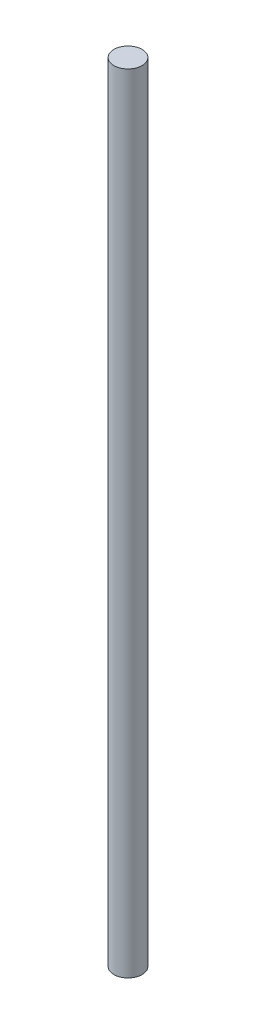
ISO-10303-21;
HEADER;
FILE_DESCRIPTION(('STEP AP214'),'2;1');
FILE_NAME('part.step','',(''),(''),'','','');
FILE_SCHEMA(('AUTOMOTIVE_DESIGN { 1 0 10303 214 1 1 1 1 }'));
ENDSEC;
DATA;
#1=APPLICATION_CONTEXT('core data for automotive mechanical design processes');
#2=APPLICATION_PROTOCOL_DEFINITION('international standard','automotive_design',2000,#1);
#3=PRODUCT_CONTEXT('',#1,'mechanical');
#4=PRODUCT('Part','Part','',(#3));
#5=PRODUCT_RELATED_PRODUCT_CATEGORY('part','',(#4));
#6=PRODUCT_DEFINITION_FORMATION('','',#4);
#7=PRODUCT_DEFINITION_CONTEXT('part definition',#1,'design');
#8=PRODUCT_DEFINITION('design','',#6,#7);
#9=PRODUCT_DEFINITION_SHAPE('','',#8);
#10=(LENGTH_UNIT() NAMED_UNIT(*) SI_UNIT(.MILLI.,.METRE.));
#11=(NAMED_UNIT(*) PLANE_ANGLE_UNIT() SI_UNIT($,.RADIAN.));
#12=(NAMED_UNIT(*) SI_UNIT($,.STERADIAN.) SOLID_ANGLE_UNIT());
#13=UNCERTAINTY_MEASURE_WITH_UNIT(LENGTH_MEASURE(1.E-05),#10,'distance_accuracy_value','');
#14=(GEOMETRIC_REPRESENTATION_CONTEXT(3) GLOBAL_UNCERTAINTY_ASSIGNED_CONTEXT((#13)) GLOBAL_UNIT_ASSIGNED_CONTEXT((#10,
#11,#12)) REPRESENTATION_CONTEXT('',''));
#15=CARTESIAN_POINT('',(0.,0.,0.));
#16=DIRECTION('',(0.,0.,1.));
#17=DIRECTION('',(1.,0.,0.));
#18=AXIS2_PLACEMENT_3D('',#15,#16,#17);
#19=CARTESIAN_POINT('',(0.,280.,0.));
#20=DIRECTION('',(0.,-1.,0.));
#21=DIRECTION('',(0.,0.,-1.));
#22=AXIS2_PLACEMENT_3D('',#19,#20,#21);
#23=CYLINDRICAL_SURFACE('',#22,5.);
#24=CARTESIAN_POINT('',(0.,280.,0.));
#25=DIRECTION('',(0.,1.,0.));
#26=DIRECTION('',(0.,0.,1.));
#27=AXIS2_PLACEMENT_3D('',#24,#25,#26);
#28=CIRCLE('',#27,5.);
#29=CARTESIAN_POINT('',(0.,280.,5.));
#30=VERTEX_POINT('',#29);
#31=EDGE_CURVE('E10',#30,#30,#28,.T.);
#32=ORIENTED_EDGE('',*,*,#31,.F.);
#33=EDGE_LOOP('',(#32));
#34=FACE_BOUND('',#33,.T.);
#35=CARTESIAN_POINT('',(0.,0.,0.));
#36=DIRECTION('',(0.,1.,0.));
#37=DIRECTION('',(0.,0.,1.));
#38=AXIS2_PLACEMENT_3D('',#35,#36,#37);
#39=CIRCLE('',#38,5.);
#40=CARTESIAN_POINT('',(0.,0.,5.));
#41=VERTEX_POINT('',#40);
#42=EDGE_CURVE('E34',#41,#41,#39,.T.);
#43=ORIENTED_EDGE('',*,*,#42,.T.);
#44=EDGE_LOOP('',(#43));
#45=FACE_BOUND('',#44,.T.);
#46=ADVANCED_FACE('F31',(#34,#45),#23,.T.);
#47=CARTESIAN_POINT('',(0.,280.,0.));
#48=DIRECTION('',(0.,1.,0.));
#49=DIRECTION('',(0.,0.,1.));
#50=AXIS2_PLACEMENT_3D('',#47,#48,#49);
#51=PLANE('',#50);
#52=ORIENTED_EDGE('',*,*,#31,.T.);
#53=EDGE_LOOP('',(#52));
#54=FACE_BOUND('',#53,.T.);
#55=ADVANCED_FACE('F46',(#54),#51,.T.);
#56=CARTESIAN_POINT('',(0.,0.,0.));
#57=DIRECTION('',(0.,1.,0.));
#58=DIRECTION('',(0.,0.,1.));
#59=AXIS2_PLACEMENT_3D('',#56,#57,#58);
#60=PLANE('',#59);
#61=ORIENTED_EDGE('',*,*,#42,.F.);
#62=EDGE_LOOP('',(#61));
#63=FACE_BOUND('',#62,.T.);
#64=ADVANCED_FACE('F44',(#63),#60,.F.);
#65=CLOSED_SHELL('',(#46,#55,#64));
#66=MANIFOLD_SOLID_BREP('B2',#65);
#67=ADVANCED_BREP_SHAPE_REPRESENTATION('',(#18,#66),#14);
#68=SHAPE_DEFINITION_REPRESENTATION(#9,#67);
ENDSEC;
END-ISO-10303-21;
